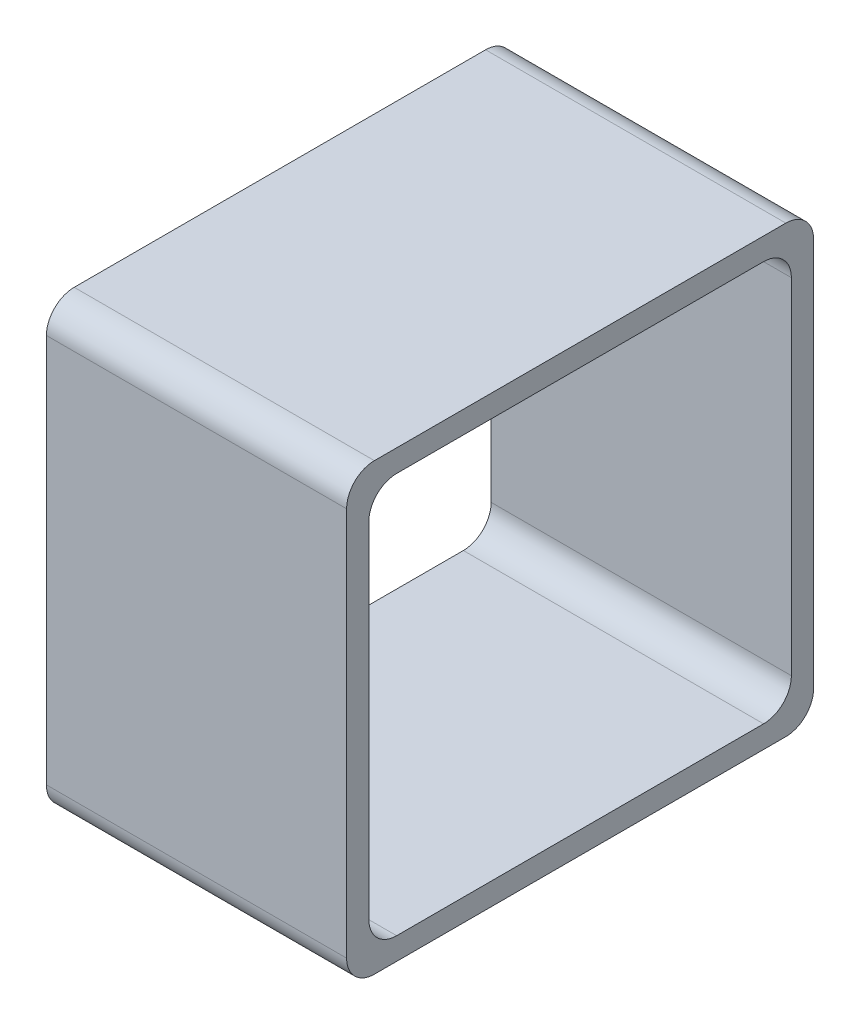
ISO-10303-21;
HEADER;
FILE_DESCRIPTION(('STEP AP214'),'2;1');
FILE_NAME('part.step','',(''),(''),'','','');
FILE_SCHEMA(('AUTOMOTIVE_DESIGN { 1 0 10303 214 1 1 1 1 }'));
ENDSEC;
DATA;
#1=APPLICATION_CONTEXT('core data for automotive mechanical design processes');
#2=APPLICATION_PROTOCOL_DEFINITION('international standard','automotive_design',2000,#1);
#3=PRODUCT_CONTEXT('',#1,'mechanical');
#4=PRODUCT('Part','Part','',(#3));
#5=PRODUCT_RELATED_PRODUCT_CATEGORY('part','',(#4));
#6=PRODUCT_DEFINITION_FORMATION('','',#4);
#7=PRODUCT_DEFINITION_CONTEXT('part definition',#1,'design');
#8=PRODUCT_DEFINITION('design','',#6,#7);
#9=PRODUCT_DEFINITION_SHAPE('','',#8);
#10=(LENGTH_UNIT() NAMED_UNIT(*) SI_UNIT(.MILLI.,.METRE.));
#11=(NAMED_UNIT(*) PLANE_ANGLE_UNIT() SI_UNIT($,.RADIAN.));
#12=(NAMED_UNIT(*) SI_UNIT($,.STERADIAN.) SOLID_ANGLE_UNIT());
#13=UNCERTAINTY_MEASURE_WITH_UNIT(LENGTH_MEASURE(1.E-05),#10,'distance_accuracy_value','');
#14=(GEOMETRIC_REPRESENTATION_CONTEXT(3) GLOBAL_UNCERTAINTY_ASSIGNED_CONTEXT((#13)) GLOBAL_UNIT_ASSIGNED_CONTEXT((#10,
#11,#12)) REPRESENTATION_CONTEXT('',''));
#15=CARTESIAN_POINT('',(0.,0.,0.));
#16=DIRECTION('',(0.,0.,1.));
#17=DIRECTION('',(1.,0.,0.));
#18=AXIS2_PLACEMENT_3D('',#15,#16,#17);
#19=CARTESIAN_POINT('',(27.,0.,0.));
#20=DIRECTION('',(-1.,0.,0.));
#21=DIRECTION('',(0.,0.,1.));
#22=AXIS2_PLACEMENT_3D('',#19,#20,#21);
#23=PLANE('',#22);
#24=DIRECTION('',(0.,0.,1.));
#25=VECTOR('',#24,1.);
#26=CARTESIAN_POINT('',(27.,20.,21.));
#27=LINE('',#26,#25);
#28=CARTESIAN_POINT('',(27.,20.,-18.5));
#29=VERTEX_POINT('',#28);
#30=CARTESIAN_POINT('',(27.,20.,18.5));
#31=VERTEX_POINT('',#30);
#32=EDGE_CURVE('E186',#29,#31,#27,.T.);
#33=ORIENTED_EDGE('',*,*,#32,.T.);
#34=CARTESIAN_POINT('',(27.,17.5,18.5));
#35=DIRECTION('',(-1.,0.,0.));
#36=DIRECTION('',(0.,0.,1.));
#37=AXIS2_PLACEMENT_3D('',#34,#35,#36);
#38=CIRCLE('',#37,2.5);
#39=CARTESIAN_POINT('',(27.,17.5,21.));
#40=VERTEX_POINT('',#39);
#41=EDGE_CURVE('E207',#31,#40,#38,.F.);
#42=ORIENTED_EDGE('',*,*,#41,.T.);
#43=DIRECTION('',(0.,-1.,0.));
#44=VECTOR('',#43,1.);
#45=CARTESIAN_POINT('',(27.,-20.,21.));
#46=LINE('',#45,#44);
#47=CARTESIAN_POINT('',(27.,-17.5,21.));
#48=VERTEX_POINT('',#47);
#49=EDGE_CURVE('E169',#40,#48,#46,.T.);
#50=ORIENTED_EDGE('',*,*,#49,.T.);
#51=CARTESIAN_POINT('',(27.,-17.5,18.5));
#52=DIRECTION('',(-1.,0.,0.));
#53=DIRECTION('',(0.,0.,1.));
#54=AXIS2_PLACEMENT_3D('',#51,#52,#53);
#55=CIRCLE('',#54,2.5);
#56=CARTESIAN_POINT('',(27.,-20.,18.5));
#57=VERTEX_POINT('',#56);
#58=EDGE_CURVE('E205',#48,#57,#55,.F.);
#59=ORIENTED_EDGE('',*,*,#58,.T.);
#60=DIRECTION('',(0.,0.,-1.));
#61=VECTOR('',#60,1.);
#62=CARTESIAN_POINT('',(27.,-20.,21.));
#63=LINE('',#62,#61);
#64=CARTESIAN_POINT('',(27.,-20.,-18.5));
#65=VERTEX_POINT('',#64);
#66=EDGE_CURVE('E292',#57,#65,#63,.T.);
#67=ORIENTED_EDGE('',*,*,#66,.T.);
#68=CARTESIAN_POINT('',(27.,-17.5,-18.5));
#69=DIRECTION('',(-1.,0.,0.));
#70=DIRECTION('',(0.,0.,1.));
#71=AXIS2_PLACEMENT_3D('',#68,#69,#70);
#72=CIRCLE('',#71,2.5);
#73=CARTESIAN_POINT('',(27.,-17.5,-21.));
#74=VERTEX_POINT('',#73);
#75=EDGE_CURVE('E203',#65,#74,#72,.F.);
#76=ORIENTED_EDGE('',*,*,#75,.T.);
#77=DIRECTION('',(0.,1.,0.));
#78=VECTOR('',#77,1.);
#79=CARTESIAN_POINT('',(27.,-20.,-21.));
#80=LINE('',#79,#78);
#81=CARTESIAN_POINT('',(27.,17.5,-21.));
#82=VERTEX_POINT('',#81);
#83=EDGE_CURVE('E294',#74,#82,#80,.T.);
#84=ORIENTED_EDGE('',*,*,#83,.T.);
#85=CARTESIAN_POINT('',(27.,17.5,-18.5));
#86=DIRECTION('',(-1.,0.,0.));
#87=DIRECTION('',(0.,0.,1.));
#88=AXIS2_PLACEMENT_3D('',#85,#86,#87);
#89=CIRCLE('',#88,2.5);
#90=EDGE_CURVE('E201',#82,#29,#89,.F.);
#91=ORIENTED_EDGE('',*,*,#90,.T.);
#92=EDGE_LOOP('',(#33,#42,#50,#59,#67,#76,#84,#91));
#93=FACE_BOUND('',#92,.T.);
#94=DIRECTION('',(0.,1.,0.));
#95=VECTOR('',#94,1.);
#96=CARTESIAN_POINT('',(27.,-18.,-19.));
#97=LINE('',#96,#95);
#98=CARTESIAN_POINT('',(27.,-15.5,-19.));
#99=VERTEX_POINT('',#98);
#100=CARTESIAN_POINT('',(27.,15.5,-19.));
#101=VERTEX_POINT('',#100);
#102=EDGE_CURVE('E269',#99,#101,#97,.T.);
#103=ORIENTED_EDGE('',*,*,#102,.F.);
#104=CARTESIAN_POINT('',(27.,-15.5,-16.5));
#105=DIRECTION('',(-1.,0.,0.));
#106=DIRECTION('',(0.,0.,1.));
#107=AXIS2_PLACEMENT_3D('',#104,#105,#106);
#108=CIRCLE('',#107,2.5);
#109=CARTESIAN_POINT('',(27.,-18.,-16.5));
#110=VERTEX_POINT('',#109);
#111=EDGE_CURVE('E11',#99,#110,#108,.T.);
#112=ORIENTED_EDGE('',*,*,#111,.T.);
#113=DIRECTION('',(0.,0.,-1.));
#114=VECTOR('',#113,1.);
#115=CARTESIAN_POINT('',(27.,-18.,19.));
#116=LINE('',#115,#114);
#117=CARTESIAN_POINT('',(27.,-18.,16.5));
#118=VERTEX_POINT('',#117);
#119=EDGE_CURVE('E177',#118,#110,#116,.T.);
#120=ORIENTED_EDGE('',*,*,#119,.F.);
#121=CARTESIAN_POINT('',(27.,-15.5,16.5));
#122=DIRECTION('',(-1.,0.,0.));
#123=DIRECTION('',(0.,0.,1.));
#124=AXIS2_PLACEMENT_3D('',#121,#122,#123);
#125=CIRCLE('',#124,2.5);
#126=CARTESIAN_POINT('',(27.,-15.5,19.));
#127=VERTEX_POINT('',#126);
#128=EDGE_CURVE('E243',#118,#127,#125,.T.);
#129=ORIENTED_EDGE('',*,*,#128,.T.);
#130=DIRECTION('',(0.,-1.,0.));
#131=VECTOR('',#130,1.);
#132=CARTESIAN_POINT('',(27.,-18.,19.));
#133=LINE('',#132,#131);
#134=CARTESIAN_POINT('',(27.,15.5,19.));
#135=VERTEX_POINT('',#134);
#136=EDGE_CURVE('E183',#135,#127,#133,.T.);
#137=ORIENTED_EDGE('',*,*,#136,.F.);
#138=CARTESIAN_POINT('',(27.,15.5,16.5));
#139=DIRECTION('',(-1.,0.,0.));
#140=DIRECTION('',(0.,0.,1.));
#141=AXIS2_PLACEMENT_3D('',#138,#139,#140);
#142=CIRCLE('',#141,2.5);
#143=CARTESIAN_POINT('',(27.,18.,16.5));
#144=VERTEX_POINT('',#143);
#145=EDGE_CURVE('E50',#135,#144,#142,.T.);
#146=ORIENTED_EDGE('',*,*,#145,.T.);
#147=DIRECTION('',(0.,0.,1.));
#148=VECTOR('',#147,1.);
#149=CARTESIAN_POINT('',(27.,18.,19.));
#150=LINE('',#149,#148);
#151=CARTESIAN_POINT('',(27.,18.,-16.5));
#152=VERTEX_POINT('',#151);
#153=EDGE_CURVE('E281',#152,#144,#150,.T.);
#154=ORIENTED_EDGE('',*,*,#153,.F.);
#155=CARTESIAN_POINT('',(27.,15.5,-16.5));
#156=DIRECTION('',(-1.,0.,0.));
#157=DIRECTION('',(0.,0.,1.));
#158=AXIS2_PLACEMENT_3D('',#155,#156,#157);
#159=CIRCLE('',#158,2.5);
#160=EDGE_CURVE('E247',#152,#101,#159,.T.);
#161=ORIENTED_EDGE('',*,*,#160,.T.);
#162=EDGE_LOOP('',(#103,#112,#120,#129,#137,#146,#154,#161));
#163=FACE_BOUND('',#162,.T.);
#164=ADVANCED_FACE('F35',(#93,#163),#23,.F.);
#165=CARTESIAN_POINT('',(0.,0.,0.));
#166=DIRECTION('',(-1.,0.,0.));
#167=DIRECTION('',(0.,0.,1.));
#168=AXIS2_PLACEMENT_3D('',#165,#166,#167);
#169=PLANE('',#168);
#170=DIRECTION('',(0.,-1.,0.));
#171=VECTOR('',#170,1.);
#172=CARTESIAN_POINT('',(0.,-20.,21.));
#173=LINE('',#172,#171);
#174=CARTESIAN_POINT('',(0.,17.5,21.));
#175=VERTEX_POINT('',#174);
#176=CARTESIAN_POINT('',(0.,-17.5,21.));
#177=VERTEX_POINT('',#176);
#178=EDGE_CURVE('E166',#175,#177,#173,.T.);
#179=ORIENTED_EDGE('',*,*,#178,.F.);
#180=CARTESIAN_POINT('',(0.,17.5,18.5));
#181=DIRECTION('',(-1.,0.,0.));
#182=DIRECTION('',(0.,0.,1.));
#183=AXIS2_PLACEMENT_3D('',#180,#181,#182);
#184=CIRCLE('',#183,2.5);
#185=CARTESIAN_POINT('',(0.,20.,18.5));
#186=VERTEX_POINT('',#185);
#187=EDGE_CURVE('E149',#175,#186,#184,.T.);
#188=ORIENTED_EDGE('',*,*,#187,.T.);
#189=DIRECTION('',(0.,0.,1.));
#190=VECTOR('',#189,1.);
#191=CARTESIAN_POINT('',(0.,20.,21.));
#192=LINE('',#191,#190);
#193=CARTESIAN_POINT('',(0.,20.,-18.5));
#194=VERTEX_POINT('',#193);
#195=EDGE_CURVE('E191',#194,#186,#192,.T.);
#196=ORIENTED_EDGE('',*,*,#195,.F.);
#197=CARTESIAN_POINT('',(0.,17.5,-18.5));
#198=DIRECTION('',(-1.,0.,0.));
#199=DIRECTION('',(0.,0.,1.));
#200=AXIS2_PLACEMENT_3D('',#197,#198,#199);
#201=CIRCLE('',#200,2.5);
#202=CARTESIAN_POINT('',(0.,17.5,-21.));
#203=VERTEX_POINT('',#202);
#204=EDGE_CURVE('E170',#194,#203,#201,.T.);
#205=ORIENTED_EDGE('',*,*,#204,.T.);
#206=DIRECTION('',(0.,1.,0.));
#207=VECTOR('',#206,1.);
#208=CARTESIAN_POINT('',(0.,-20.,-21.));
#209=LINE('',#208,#207);
#210=CARTESIAN_POINT('',(0.,-17.5,-21.));
#211=VERTEX_POINT('',#210);
#212=EDGE_CURVE('E180',#211,#203,#209,.T.);
#213=ORIENTED_EDGE('',*,*,#212,.F.);
#214=CARTESIAN_POINT('',(0.,-17.5,-18.5));
#215=DIRECTION('',(-1.,0.,0.));
#216=DIRECTION('',(0.,0.,1.));
#217=AXIS2_PLACEMENT_3D('',#214,#215,#216);
#218=CIRCLE('',#217,2.5);
#219=CARTESIAN_POINT('',(0.,-20.,-18.5));
#220=VERTEX_POINT('',#219);
#221=EDGE_CURVE('E195',#211,#220,#218,.T.);
#222=ORIENTED_EDGE('',*,*,#221,.T.);
#223=DIRECTION('',(0.,0.,-1.));
#224=VECTOR('',#223,1.);
#225=CARTESIAN_POINT('',(0.,-20.,21.));
#226=LINE('',#225,#224);
#227=CARTESIAN_POINT('',(0.,-20.,18.5));
#228=VERTEX_POINT('',#227);
#229=EDGE_CURVE('E176',#228,#220,#226,.T.);
#230=ORIENTED_EDGE('',*,*,#229,.F.);
#231=CARTESIAN_POINT('',(0.,-17.5,18.5));
#232=DIRECTION('',(-1.,0.,0.));
#233=DIRECTION('',(0.,0.,1.));
#234=AXIS2_PLACEMENT_3D('',#231,#232,#233);
#235=CIRCLE('',#234,2.5);
#236=EDGE_CURVE('E160',#228,#177,#235,.T.);
#237=ORIENTED_EDGE('',*,*,#236,.T.);
#238=EDGE_LOOP('',(#179,#188,#196,#205,#213,#222,#230,#237));
#239=FACE_BOUND('',#238,.T.);
#240=DIRECTION('',(0.,-1.,0.));
#241=VECTOR('',#240,1.);
#242=CARTESIAN_POINT('',(0.,-18.,19.));
#243=LINE('',#242,#241);
#244=CARTESIAN_POINT('',(0.,15.5,19.));
#245=VERTEX_POINT('',#244);
#246=CARTESIAN_POINT('',(0.,-15.5,19.));
#247=VERTEX_POINT('',#246);
#248=EDGE_CURVE('E288',#245,#247,#243,.T.);
#249=ORIENTED_EDGE('',*,*,#248,.T.);
#250=CARTESIAN_POINT('',(0.,-15.5,16.5));
#251=DIRECTION('',(-1.,0.,0.));
#252=DIRECTION('',(0.,0.,1.));
#253=AXIS2_PLACEMENT_3D('',#250,#251,#252);
#254=CIRCLE('',#253,2.5);
#255=CARTESIAN_POINT('',(0.,-18.,16.5));
#256=VERTEX_POINT('',#255);
#257=EDGE_CURVE('E241',#247,#256,#254,.F.);
#258=ORIENTED_EDGE('',*,*,#257,.T.);
#259=DIRECTION('',(0.,0.,-1.));
#260=VECTOR('',#259,1.);
#261=CARTESIAN_POINT('',(0.,-18.,19.));
#262=LINE('',#261,#260);
#263=CARTESIAN_POINT('',(0.,-18.,-16.5));
#264=VERTEX_POINT('',#263);
#265=EDGE_CURVE('E254',#256,#264,#262,.T.);
#266=ORIENTED_EDGE('',*,*,#265,.T.);
#267=CARTESIAN_POINT('',(0.,-15.5,-16.5));
#268=DIRECTION('',(-1.,0.,0.));
#269=DIRECTION('',(0.,0.,1.));
#270=AXIS2_PLACEMENT_3D('',#267,#268,#269);
#271=CIRCLE('',#270,2.5);
#272=CARTESIAN_POINT('',(0.,-15.5,-19.));
#273=VERTEX_POINT('',#272);
#274=EDGE_CURVE('E43',#264,#273,#271,.F.);
#275=ORIENTED_EDGE('',*,*,#274,.T.);
#276=DIRECTION('',(0.,1.,0.));
#277=VECTOR('',#276,1.);
#278=CARTESIAN_POINT('',(0.,-18.,-19.));
#279=LINE('',#278,#277);
#280=CARTESIAN_POINT('',(0.,15.5,-19.));
#281=VERTEX_POINT('',#280);
#282=EDGE_CURVE('E252',#273,#281,#279,.T.);
#283=ORIENTED_EDGE('',*,*,#282,.T.);
#284=CARTESIAN_POINT('',(0.,15.5,-16.5));
#285=DIRECTION('',(-1.,0.,0.));
#286=DIRECTION('',(0.,0.,1.));
#287=AXIS2_PLACEMENT_3D('',#284,#285,#286);
#288=CIRCLE('',#287,2.5);
#289=CARTESIAN_POINT('',(0.,18.,-16.5));
#290=VERTEX_POINT('',#289);
#291=EDGE_CURVE('E245',#281,#290,#288,.F.);
#292=ORIENTED_EDGE('',*,*,#291,.T.);
#293=DIRECTION('',(0.,0.,1.));
#294=VECTOR('',#293,1.);
#295=CARTESIAN_POINT('',(0.,18.,19.));
#296=LINE('',#295,#294);
#297=CARTESIAN_POINT('',(0.,18.,16.5));
#298=VERTEX_POINT('',#297);
#299=EDGE_CURVE('E263',#290,#298,#296,.T.);
#300=ORIENTED_EDGE('',*,*,#299,.T.);
#301=CARTESIAN_POINT('',(0.,15.5,16.5));
#302=DIRECTION('',(-1.,0.,0.));
#303=DIRECTION('',(0.,0.,1.));
#304=AXIS2_PLACEMENT_3D('',#301,#302,#303);
#305=CIRCLE('',#304,2.5);
#306=EDGE_CURVE('E238',#298,#245,#305,.F.);
#307=ORIENTED_EDGE('',*,*,#306,.T.);
#308=EDGE_LOOP('',(#249,#258,#266,#275,#283,#292,#300,#307));
#309=FACE_BOUND('',#308,.T.);
#310=ADVANCED_FACE('F173',(#239,#309),#169,.T.);
#311=CARTESIAN_POINT('',(27.,-20.,21.));
#312=DIRECTION('',(0.,0.,-1.));
#313=DIRECTION('',(-1.,0.,0.));
#314=AXIS2_PLACEMENT_3D('',#311,#312,#313);
#315=PLANE('',#314);
#316=ORIENTED_EDGE('',*,*,#49,.F.);
#317=DIRECTION('',(-1.,0.,0.));
#318=VECTOR('',#317,1.);
#319=CARTESIAN_POINT('',(27.,17.5,21.));
#320=LINE('',#319,#318);
#321=EDGE_CURVE('E153',#40,#175,#320,.T.);
#322=ORIENTED_EDGE('',*,*,#321,.T.);
#323=ORIENTED_EDGE('',*,*,#178,.T.);
#324=DIRECTION('',(-1.,0.,0.));
#325=VECTOR('',#324,1.);
#326=CARTESIAN_POINT('',(27.,-17.5,21.));
#327=LINE('',#326,#325);
#328=EDGE_CURVE('E171',#177,#48,#327,.F.);
#329=ORIENTED_EDGE('',*,*,#328,.T.);
#330=EDGE_LOOP('',(#316,#322,#323,#329));
#331=FACE_BOUND('',#330,.T.);
#332=ADVANCED_FACE('F165',(#331),#315,.F.);
#333=CARTESIAN_POINT('',(27.,-20.,21.));
#334=DIRECTION('',(0.,1.,0.));
#335=DIRECTION('',(0.,0.,1.));
#336=AXIS2_PLACEMENT_3D('',#333,#334,#335);
#337=PLANE('',#336);
#338=ORIENTED_EDGE('',*,*,#66,.F.);
#339=DIRECTION('',(-1.,0.,0.));
#340=VECTOR('',#339,1.);
#341=CARTESIAN_POINT('',(27.,-20.,18.5));
#342=LINE('',#341,#340);
#343=EDGE_CURVE('E225',#57,#228,#342,.T.);
#344=ORIENTED_EDGE('',*,*,#343,.T.);
#345=ORIENTED_EDGE('',*,*,#229,.T.);
#346=DIRECTION('',(-1.,0.,0.));
#347=VECTOR('',#346,1.);
#348=CARTESIAN_POINT('',(27.,-20.,-18.5));
#349=LINE('',#348,#347);
#350=EDGE_CURVE('E223',#220,#65,#349,.F.);
#351=ORIENTED_EDGE('',*,*,#350,.T.);
#352=EDGE_LOOP('',(#338,#344,#345,#351));
#353=FACE_BOUND('',#352,.T.);
#354=ADVANCED_FACE('F316',(#353),#337,.F.);
#355=CARTESIAN_POINT('',(27.,-20.,-21.));
#356=DIRECTION('',(0.,0.,1.));
#357=DIRECTION('',(1.,0.,0.));
#358=AXIS2_PLACEMENT_3D('',#355,#356,#357);
#359=PLANE('',#358);
#360=ORIENTED_EDGE('',*,*,#83,.F.);
#361=DIRECTION('',(-1.,0.,0.));
#362=VECTOR('',#361,1.);
#363=CARTESIAN_POINT('',(27.,-17.5,-21.));
#364=LINE('',#363,#362);
#365=EDGE_CURVE('E235',#74,#211,#364,.T.);
#366=ORIENTED_EDGE('',*,*,#365,.T.);
#367=ORIENTED_EDGE('',*,*,#212,.T.);
#368=DIRECTION('',(-1.,0.,0.));
#369=VECTOR('',#368,1.);
#370=CARTESIAN_POINT('',(27.,17.5,-21.));
#371=LINE('',#370,#369);
#372=EDGE_CURVE('E233',#203,#82,#371,.F.);
#373=ORIENTED_EDGE('',*,*,#372,.T.);
#374=EDGE_LOOP('',(#360,#366,#367,#373));
#375=FACE_BOUND('',#374,.T.);
#376=ADVANCED_FACE('F308',(#375),#359,.F.);
#377=CARTESIAN_POINT('',(27.,20.,21.));
#378=DIRECTION('',(0.,-1.,0.));
#379=DIRECTION('',(0.,0.,-1.));
#380=AXIS2_PLACEMENT_3D('',#377,#378,#379);
#381=PLANE('',#380);
#382=ORIENTED_EDGE('',*,*,#195,.T.);
#383=DIRECTION('',(-1.,0.,0.));
#384=VECTOR('',#383,1.);
#385=CARTESIAN_POINT('',(27.,20.,18.5));
#386=LINE('',#385,#384);
#387=EDGE_CURVE('E154',#186,#31,#386,.F.);
#388=ORIENTED_EDGE('',*,*,#387,.T.);
#389=ORIENTED_EDGE('',*,*,#32,.F.);
#390=DIRECTION('',(-1.,0.,0.));
#391=VECTOR('',#390,1.);
#392=CARTESIAN_POINT('',(27.,20.,-18.5));
#393=LINE('',#392,#391);
#394=EDGE_CURVE('E159',#29,#194,#393,.T.);
#395=ORIENTED_EDGE('',*,*,#394,.T.);
#396=EDGE_LOOP('',(#382,#388,#389,#395));
#397=FACE_BOUND('',#396,.T.);
#398=ADVANCED_FACE('F303',(#397),#381,.F.);
#399=CARTESIAN_POINT('',(27.,-18.,-19.));
#400=DIRECTION('',(0.,0.,1.));
#401=DIRECTION('',(1.,0.,0.));
#402=AXIS2_PLACEMENT_3D('',#399,#400,#401);
#403=PLANE('',#402);
#404=ORIENTED_EDGE('',*,*,#102,.T.);
#405=DIRECTION('',(-1.,0.,0.));
#406=VECTOR('',#405,1.);
#407=CARTESIAN_POINT('',(0.,15.5,-19.));
#408=LINE('',#407,#406);
#409=EDGE_CURVE('E230',#101,#281,#408,.T.);
#410=ORIENTED_EDGE('',*,*,#409,.T.);
#411=ORIENTED_EDGE('',*,*,#282,.F.);
#412=DIRECTION('',(-1.,0.,0.));
#413=VECTOR('',#412,1.);
#414=CARTESIAN_POINT('',(27.,-15.5,-19.));
#415=LINE('',#414,#413);
#416=EDGE_CURVE('E228',#273,#99,#415,.F.);
#417=ORIENTED_EDGE('',*,*,#416,.T.);
#418=EDGE_LOOP('',(#404,#410,#411,#417));
#419=FACE_BOUND('',#418,.T.);
#420=ADVANCED_FACE('F260',(#419),#403,.T.);
#421=CARTESIAN_POINT('',(27.,18.,19.));
#422=DIRECTION('',(0.,-1.,0.));
#423=DIRECTION('',(0.,0.,-1.));
#424=AXIS2_PLACEMENT_3D('',#421,#422,#423);
#425=PLANE('',#424);
#426=ORIENTED_EDGE('',*,*,#153,.T.);
#427=DIRECTION('',(-1.,0.,0.));
#428=VECTOR('',#427,1.);
#429=CARTESIAN_POINT('',(0.,18.,16.5));
#430=LINE('',#429,#428);
#431=EDGE_CURVE('E210',#144,#298,#430,.T.);
#432=ORIENTED_EDGE('',*,*,#431,.T.);
#433=ORIENTED_EDGE('',*,*,#299,.F.);
#434=DIRECTION('',(-1.,0.,0.));
#435=VECTOR('',#434,1.);
#436=CARTESIAN_POINT('',(27.,18.,-16.5));
#437=LINE('',#436,#435);
#438=EDGE_CURVE('E57',#290,#152,#437,.F.);
#439=ORIENTED_EDGE('',*,*,#438,.T.);
#440=EDGE_LOOP('',(#426,#432,#433,#439));
#441=FACE_BOUND('',#440,.T.);
#442=ADVANCED_FACE('F356',(#441),#425,.T.);
#443=CARTESIAN_POINT('',(27.,-18.,19.));
#444=DIRECTION('',(0.,0.,-1.));
#445=DIRECTION('',(-1.,0.,0.));
#446=AXIS2_PLACEMENT_3D('',#443,#444,#445);
#447=PLANE('',#446);
#448=ORIENTED_EDGE('',*,*,#248,.F.);
#449=DIRECTION('',(-1.,0.,0.));
#450=VECTOR('',#449,1.);
#451=CARTESIAN_POINT('',(27.,15.5,19.));
#452=LINE('',#451,#450);
#453=EDGE_CURVE('E216',#245,#135,#452,.F.);
#454=ORIENTED_EDGE('',*,*,#453,.T.);
#455=ORIENTED_EDGE('',*,*,#136,.T.);
#456=DIRECTION('',(-1.,0.,0.));
#457=VECTOR('',#456,1.);
#458=CARTESIAN_POINT('',(0.,-15.5,19.));
#459=LINE('',#458,#457);
#460=EDGE_CURVE('E213',#127,#247,#459,.T.);
#461=ORIENTED_EDGE('',*,*,#460,.T.);
#462=EDGE_LOOP('',(#448,#454,#455,#461));
#463=FACE_BOUND('',#462,.T.);
#464=ADVANCED_FACE('F279',(#463),#447,.T.);
#465=CARTESIAN_POINT('',(27.,-18.,19.));
#466=DIRECTION('',(0.,1.,0.));
#467=DIRECTION('',(0.,0.,1.));
#468=AXIS2_PLACEMENT_3D('',#465,#466,#467);
#469=PLANE('',#468);
#470=ORIENTED_EDGE('',*,*,#265,.F.);
#471=DIRECTION('',(-1.,0.,0.));
#472=VECTOR('',#471,1.);
#473=CARTESIAN_POINT('',(27.,-18.,16.5));
#474=LINE('',#473,#472);
#475=EDGE_CURVE('E221',#256,#118,#474,.F.);
#476=ORIENTED_EDGE('',*,*,#475,.T.);
#477=ORIENTED_EDGE('',*,*,#119,.T.);
#478=DIRECTION('',(-1.,0.,0.));
#479=VECTOR('',#478,1.);
#480=CARTESIAN_POINT('',(0.,-18.,-16.5));
#481=LINE('',#480,#479);
#482=EDGE_CURVE('E218',#110,#264,#481,.T.);
#483=ORIENTED_EDGE('',*,*,#482,.T.);
#484=EDGE_LOOP('',(#470,#476,#477,#483));
#485=FACE_BOUND('',#484,.T.);
#486=ADVANCED_FACE('F271',(#485),#469,.T.);
#487=CARTESIAN_POINT('',(27.,17.5,18.5));
#488=DIRECTION('',(-1.,0.,0.));
#489=DIRECTION('',(0.,0.,1.));
#490=AXIS2_PLACEMENT_3D('',#487,#488,#489);
#491=CYLINDRICAL_SURFACE('',#490,2.5);
#492=ORIENTED_EDGE('',*,*,#41,.F.);
#493=ORIENTED_EDGE('',*,*,#387,.F.);
#494=ORIENTED_EDGE('',*,*,#187,.F.);
#495=ORIENTED_EDGE('',*,*,#321,.F.);
#496=EDGE_LOOP('',(#492,#493,#494,#495));
#497=FACE_BOUND('',#496,.T.);
#498=ADVANCED_FACE('F152',(#497),#491,.T.);
#499=CARTESIAN_POINT('',(27.,15.5,16.5));
#500=DIRECTION('',(1.,0.,0.));
#501=DIRECTION('',(0.,0.,-1.));
#502=AXIS2_PLACEMENT_3D('',#499,#500,#501);
#503=CYLINDRICAL_SURFACE('',#502,2.5);
#504=ORIENTED_EDGE('',*,*,#145,.F.);
#505=ORIENTED_EDGE('',*,*,#453,.F.);
#506=ORIENTED_EDGE('',*,*,#306,.F.);
#507=ORIENTED_EDGE('',*,*,#431,.F.);
#508=EDGE_LOOP('',(#504,#505,#506,#507));
#509=FACE_BOUND('',#508,.T.);
#510=ADVANCED_FACE('F330',(#509),#503,.F.);
#511=CARTESIAN_POINT('',(27.,-15.5,16.5));
#512=DIRECTION('',(1.,0.,0.));
#513=DIRECTION('',(0.,0.,-1.));
#514=AXIS2_PLACEMENT_3D('',#511,#512,#513);
#515=CYLINDRICAL_SURFACE('',#514,2.5);
#516=ORIENTED_EDGE('',*,*,#128,.F.);
#517=ORIENTED_EDGE('',*,*,#475,.F.);
#518=ORIENTED_EDGE('',*,*,#257,.F.);
#519=ORIENTED_EDGE('',*,*,#460,.F.);
#520=EDGE_LOOP('',(#516,#517,#518,#519));
#521=FACE_BOUND('',#520,.T.);
#522=ADVANCED_FACE('F274',(#521),#515,.F.);
#523=CARTESIAN_POINT('',(27.,-17.5,18.5));
#524=DIRECTION('',(-1.,0.,0.));
#525=DIRECTION('',(0.,0.,1.));
#526=AXIS2_PLACEMENT_3D('',#523,#524,#525);
#527=CYLINDRICAL_SURFACE('',#526,2.5);
#528=ORIENTED_EDGE('',*,*,#58,.F.);
#529=ORIENTED_EDGE('',*,*,#328,.F.);
#530=ORIENTED_EDGE('',*,*,#236,.F.);
#531=ORIENTED_EDGE('',*,*,#343,.F.);
#532=EDGE_LOOP('',(#528,#529,#530,#531));
#533=FACE_BOUND('',#532,.T.);
#534=ADVANCED_FACE('F320',(#533),#527,.T.);
#535=CARTESIAN_POINT('',(27.,15.5,-16.5));
#536=DIRECTION('',(1.,0.,0.));
#537=DIRECTION('',(0.,0.,-1.));
#538=AXIS2_PLACEMENT_3D('',#535,#536,#537);
#539=CYLINDRICAL_SURFACE('',#538,2.5);
#540=ORIENTED_EDGE('',*,*,#160,.F.);
#541=ORIENTED_EDGE('',*,*,#438,.F.);
#542=ORIENTED_EDGE('',*,*,#291,.F.);
#543=ORIENTED_EDGE('',*,*,#409,.F.);
#544=EDGE_LOOP('',(#540,#541,#542,#543));
#545=FACE_BOUND('',#544,.T.);
#546=ADVANCED_FACE('F322',(#545),#539,.F.);
#547=CARTESIAN_POINT('',(27.,-15.5,-16.5));
#548=DIRECTION('',(1.,0.,0.));
#549=DIRECTION('',(0.,0.,-1.));
#550=AXIS2_PLACEMENT_3D('',#547,#548,#549);
#551=CYLINDRICAL_SURFACE('',#550,2.5);
#552=ORIENTED_EDGE('',*,*,#111,.F.);
#553=ORIENTED_EDGE('',*,*,#416,.F.);
#554=ORIENTED_EDGE('',*,*,#274,.F.);
#555=ORIENTED_EDGE('',*,*,#482,.F.);
#556=EDGE_LOOP('',(#552,#553,#554,#555));
#557=FACE_BOUND('',#556,.T.);
#558=ADVANCED_FACE('F266',(#557),#551,.F.);
#559=CARTESIAN_POINT('',(27.,-17.5,-18.5));
#560=DIRECTION('',(-1.,0.,0.));
#561=DIRECTION('',(0.,0.,1.));
#562=AXIS2_PLACEMENT_3D('',#559,#560,#561);
#563=CYLINDRICAL_SURFACE('',#562,2.5);
#564=ORIENTED_EDGE('',*,*,#75,.F.);
#565=ORIENTED_EDGE('',*,*,#350,.F.);
#566=ORIENTED_EDGE('',*,*,#221,.F.);
#567=ORIENTED_EDGE('',*,*,#365,.F.);
#568=EDGE_LOOP('',(#564,#565,#566,#567));
#569=FACE_BOUND('',#568,.T.);
#570=ADVANCED_FACE('F312',(#569),#563,.T.);
#571=CARTESIAN_POINT('',(27.,17.5,-18.5));
#572=DIRECTION('',(-1.,0.,0.));
#573=DIRECTION('',(0.,0.,1.));
#574=AXIS2_PLACEMENT_3D('',#571,#572,#573);
#575=CYLINDRICAL_SURFACE('',#574,2.5);
#576=ORIENTED_EDGE('',*,*,#90,.F.);
#577=ORIENTED_EDGE('',*,*,#372,.F.);
#578=ORIENTED_EDGE('',*,*,#204,.F.);
#579=ORIENTED_EDGE('',*,*,#394,.F.);
#580=EDGE_LOOP('',(#576,#577,#578,#579));
#581=FACE_BOUND('',#580,.T.);
#582=ADVANCED_FACE('F37',(#581),#575,.T.);
#583=CLOSED_SHELL('',(#164,#310,#332,#354,#376,#398,#420,#442,#464,#486,#498,#510,#522,#534,
#546,#558,#570,#582));
#584=MANIFOLD_SOLID_BREP('B2',#583);
#585=ADVANCED_BREP_SHAPE_REPRESENTATION('',(#18,#584),#14);
#586=SHAPE_DEFINITION_REPRESENTATION(#9,#585);
ENDSEC;
END-ISO-10303-21;
